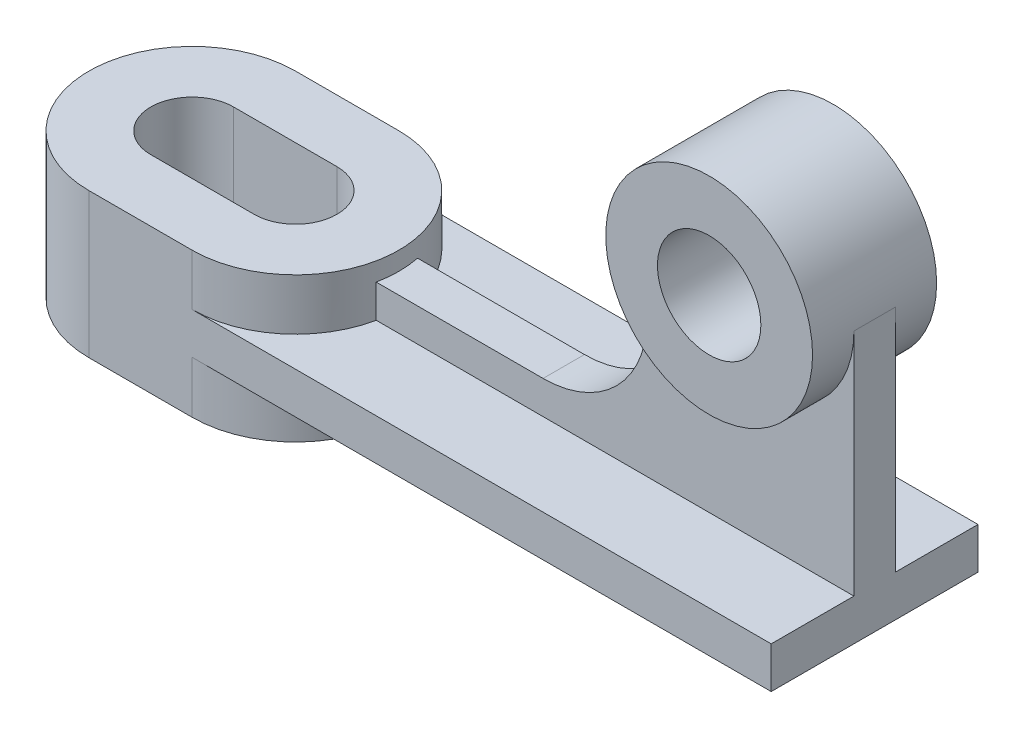
ISO-10303-21;
HEADER;
FILE_DESCRIPTION(('STEP AP214'),'2;1');
FILE_NAME('part.step','',(''),(''),'','','');
FILE_SCHEMA(('AUTOMOTIVE_DESIGN { 1 0 10303 214 1 1 1 1 }'));
ENDSEC;
DATA;
#1=APPLICATION_CONTEXT('core data for automotive mechanical design processes');
#2=APPLICATION_PROTOCOL_DEFINITION('international standard','automotive_design',2000,#1);
#3=PRODUCT_CONTEXT('',#1,'mechanical');
#4=PRODUCT('Part','Part','',(#3));
#5=PRODUCT_RELATED_PRODUCT_CATEGORY('part','',(#4));
#6=PRODUCT_DEFINITION_FORMATION('','',#4);
#7=PRODUCT_DEFINITION_CONTEXT('part definition',#1,'design');
#8=PRODUCT_DEFINITION('design','',#6,#7);
#9=PRODUCT_DEFINITION_SHAPE('','',#8);
#10=(LENGTH_UNIT() NAMED_UNIT(*) SI_UNIT(.MILLI.,.METRE.));
#11=(NAMED_UNIT(*) PLANE_ANGLE_UNIT() SI_UNIT($,.RADIAN.));
#12=(NAMED_UNIT(*) SI_UNIT($,.STERADIAN.) SOLID_ANGLE_UNIT());
#13=UNCERTAINTY_MEASURE_WITH_UNIT(LENGTH_MEASURE(1.E-05),#10,'distance_accuracy_value','');
#14=(GEOMETRIC_REPRESENTATION_CONTEXT(3) GLOBAL_UNCERTAINTY_ASSIGNED_CONTEXT((#13)) GLOBAL_UNIT_ASSIGNED_CONTEXT((#10,
#11,#12)) REPRESENTATION_CONTEXT('',''));
#15=CARTESIAN_POINT('',(0.,0.,0.));
#16=DIRECTION('',(0.,0.,1.));
#17=DIRECTION('',(1.,0.,0.));
#18=AXIS2_PLACEMENT_3D('',#15,#16,#17);
#19=CARTESIAN_POINT('',(127.5,78.0704673986052,15.));
#20=DIRECTION('',(0.,0.,1.));
#21=DIRECTION('',(1.,0.,0.));
#22=AXIS2_PLACEMENT_3D('',#19,#20,#21);
#23=PLANE('',#22);
#24=CARTESIAN_POINT('',(127.5,78.0704673986052,15.));
#25=DIRECTION('',(0.,0.,1.));
#26=DIRECTION('',(1.,0.,0.));
#27=AXIS2_PLACEMENT_3D('',#24,#25,#26);
#28=CIRCLE('',#27,25.);
#29=CARTESIAN_POINT('',(152.5,78.0704673986052,15.));
#30=VERTEX_POINT('',#29);
#31=EDGE_CURVE('E11',#30,#30,#28,.T.);
#32=ORIENTED_EDGE('',*,*,#31,.T.);
#33=EDGE_LOOP('',(#32));
#34=FACE_BOUND('',#33,.T.);
#35=CARTESIAN_POINT('',(127.5,78.0704673986052,15.));
#36=DIRECTION('',(0.,0.,1.));
#37=DIRECTION('',(1.,0.,0.));
#38=AXIS2_PLACEMENT_3D('',#35,#36,#37);
#39=CIRCLE('',#38,12.5);
#40=CARTESIAN_POINT('',(140.,78.0704673986052,15.));
#41=VERTEX_POINT('',#40);
#42=EDGE_CURVE('E56',#41,#41,#39,.T.);
#43=ORIENTED_EDGE('',*,*,#42,.F.);
#44=EDGE_LOOP('',(#43));
#45=FACE_BOUND('',#44,.T.);
#46=ADVANCED_FACE('F45',(#34,#45),#23,.T.);
#47=CARTESIAN_POINT('',(127.5,78.0704673986052,-15.));
#48=DIRECTION('',(0.,0.,1.));
#49=DIRECTION('',(1.,0.,0.));
#50=AXIS2_PLACEMENT_3D('',#47,#48,#49);
#51=PLANE('',#50);
#52=CARTESIAN_POINT('',(127.5,78.0704673986052,-15.));
#53=DIRECTION('',(0.,0.,1.));
#54=DIRECTION('',(1.,0.,0.));
#55=AXIS2_PLACEMENT_3D('',#52,#53,#54);
#56=CIRCLE('',#55,25.);
#57=CARTESIAN_POINT('',(152.5,78.0704673986052,-15.));
#58=VERTEX_POINT('',#57);
#59=EDGE_CURVE('E49',#58,#58,#56,.T.);
#60=ORIENTED_EDGE('',*,*,#59,.F.);
#61=EDGE_LOOP('',(#60));
#62=FACE_BOUND('',#61,.T.);
#63=CARTESIAN_POINT('',(127.5,78.0704673986052,-15.));
#64=DIRECTION('',(0.,0.,1.));
#65=DIRECTION('',(1.,0.,0.));
#66=AXIS2_PLACEMENT_3D('',#63,#64,#65);
#67=CIRCLE('',#66,12.5);
#68=CARTESIAN_POINT('',(140.,78.0704673986052,-15.));
#69=VERTEX_POINT('',#68);
#70=EDGE_CURVE('E58',#69,#69,#67,.T.);
#71=ORIENTED_EDGE('',*,*,#70,.T.);
#72=EDGE_LOOP('',(#71));
#73=FACE_BOUND('',#72,.T.);
#74=ADVANCED_FACE('F68',(#62,#73),#51,.F.);
#75=CARTESIAN_POINT('',(127.5,78.0704673986052,15.));
#76=DIRECTION('',(0.,0.,-1.));
#77=DIRECTION('',(-1.,0.,0.));
#78=AXIS2_PLACEMENT_3D('',#75,#76,#77);
#79=CYLINDRICAL_SURFACE('',#78,25.);
#80=ORIENTED_EDGE('',*,*,#31,.F.);
#81=EDGE_LOOP('',(#80));
#82=FACE_BOUND('',#81,.T.);
#83=ORIENTED_EDGE('',*,*,#59,.T.);
#84=EDGE_LOOP('',(#83));
#85=FACE_BOUND('',#84,.T.);
#86=ADVANCED_FACE('F47',(#82,#85),#79,.T.);
#87=CARTESIAN_POINT('',(127.5,78.0704673986052,15.));
#88=DIRECTION('',(0.,0.,-1.));
#89=DIRECTION('',(-1.,0.,0.));
#90=AXIS2_PLACEMENT_3D('',#87,#88,#89);
#91=CYLINDRICAL_SURFACE('',#90,12.5);
#92=ORIENTED_EDGE('',*,*,#42,.T.);
#93=EDGE_LOOP('',(#92));
#94=FACE_BOUND('',#93,.T.);
#95=ORIENTED_EDGE('',*,*,#70,.F.);
#96=EDGE_LOOP('',(#95));
#97=FACE_BOUND('',#96,.T.);
#98=ADVANCED_FACE('F64',(#94,#97),#91,.F.);
#99=CLOSED_SHELL('',(#46,#74,#86,#98));
#100=MANIFOLD_SOLID_BREP('B2',#99);
#101=CARTESIAN_POINT('',(-37.501,22.5704673986052,25.));
#102=DIRECTION('',(0.,1.,0.));
#103=DIRECTION('',(0.,0.,1.));
#104=AXIS2_PLACEMENT_3D('',#101,#102,#103);
#105=PLANE('',#104);
#106=DIRECTION('',(1.,0.,0.));
#107=VECTOR('',#106,1.);
#108=CARTESIAN_POINT('',(152.5,22.5704673986052,5.));
#109=LINE('',#108,#107);
#110=CARTESIAN_POINT('',(36.99489742786,22.5704673986052,5.));
#111=VERTEX_POINT('',#110);
#112=CARTESIAN_POINT('',(152.5,22.5704673986052,5.));
#113=VERTEX_POINT('',#112);
#114=EDGE_CURVE('E250',#111,#113,#109,.T.);
#115=ORIENTED_EDGE('',*,*,#114,.F.);
#116=CARTESIAN_POINT('',(12.5,22.5704673986052,0.));
#117=DIRECTION('',(0.,1.,0.));
#118=DIRECTION('',(0.,0.,1.));
#119=AXIS2_PLACEMENT_3D('',#116,#117,#118);
#120=CIRCLE('',#119,25.);
#121=CARTESIAN_POINT('',(12.5,22.5704673986052,25.));
#122=VERTEX_POINT('',#121);
#123=EDGE_CURVE('E254',#111,#122,#120,.F.);
#124=ORIENTED_EDGE('',*,*,#123,.T.);
#125=DIRECTION('',(1.,0.,0.));
#126=VECTOR('',#125,1.);
#127=CARTESIAN_POINT('',(-37.501,22.5704673986052,25.));
#128=LINE('',#127,#126);
#129=CARTESIAN_POINT('',(152.5,22.5704673986052,25.));
#130=VERTEX_POINT('',#129);
#131=EDGE_CURVE('E377',#122,#130,#128,.T.);
#132=ORIENTED_EDGE('',*,*,#131,.T.);
#133=DIRECTION('',(0.,0.,1.));
#134=VECTOR('',#133,1.);
#135=CARTESIAN_POINT('',(152.5,22.5704673986052,25.));
#136=LINE('',#135,#134);
#137=EDGE_CURVE('E256',#113,#130,#136,.T.);
#138=ORIENTED_EDGE('',*,*,#137,.F.);
#139=EDGE_LOOP('',(#115,#124,#132,#138));
#140=FACE_BOUND('',#139,.T.);
#141=ADVANCED_FACE('F120',(#140),#105,.T.);
#142=CARTESIAN_POINT('',(12.5,35.,0.));
#143=DIRECTION('',(0.,-1.,0.));
#144=DIRECTION('',(0.,0.,-1.));
#145=AXIS2_PLACEMENT_3D('',#142,#143,#144);
#146=CYLINDRICAL_SURFACE('',#145,25.);
#147=DIRECTION('',(0.,-1.,0.));
#148=VECTOR('',#147,1.);
#149=CARTESIAN_POINT('',(36.9948974278318,35.,5.));
#150=LINE('',#149,#148);
#151=CARTESIAN_POINT('',(36.99489742786,30.5704673986052,5.));
#152=VERTEX_POINT('',#151);
#153=EDGE_CURVE('E264',#111,#152,#150,.F.);
#154=ORIENTED_EDGE('',*,*,#153,.T.);
#155=CARTESIAN_POINT('',(12.5,30.5704673986052,0.));
#156=DIRECTION('',(0.,-1.,0.));
#157=DIRECTION('',(0.,0.,-1.));
#158=AXIS2_PLACEMENT_3D('',#155,#156,#157);
#159=CIRCLE('',#158,25.);
#160=CARTESIAN_POINT('',(36.99489742786,30.5704673986052,-5.));
#161=VERTEX_POINT('',#160);
#162=EDGE_CURVE('E430',#152,#161,#159,.F.);
#163=ORIENTED_EDGE('',*,*,#162,.T.);
#164=DIRECTION('',(0.,-1.,0.));
#165=VECTOR('',#164,1.);
#166=CARTESIAN_POINT('',(36.9948974278318,35.,-5.));
#167=LINE('',#166,#165);
#168=CARTESIAN_POINT('',(36.9948974278318,22.5704673986052,-5.));
#169=VERTEX_POINT('',#168);
#170=EDGE_CURVE('E369',#161,#169,#167,.T.);
#171=ORIENTED_EDGE('',*,*,#170,.T.);
#172=CARTESIAN_POINT('',(12.5,22.5704673986052,-25.));
#173=VERTEX_POINT('',#172);
#174=EDGE_CURVE('E276',#173,#169,#120,.F.);
#175=ORIENTED_EDGE('',*,*,#174,.F.);
#176=DIRECTION('',(0.,-1.,0.));
#177=VECTOR('',#176,1.);
#178=CARTESIAN_POINT('',(12.5,35.,-25.));
#179=LINE('',#178,#177);
#180=CARTESIAN_POINT('',(12.5,35.,-25.));
#181=VERTEX_POINT('',#180);
#182=EDGE_CURVE('E339',#181,#173,#179,.T.);
#183=ORIENTED_EDGE('',*,*,#182,.F.);
#184=CARTESIAN_POINT('',(12.5,35.,0.));
#185=DIRECTION('',(0.,1.,0.));
#186=DIRECTION('',(0.,0.,1.));
#187=AXIS2_PLACEMENT_3D('',#184,#185,#186);
#188=CIRCLE('',#187,25.);
#189=CARTESIAN_POINT('',(12.5,35.,25.));
#190=VERTEX_POINT('',#189);
#191=EDGE_CURVE('E322',#190,#181,#188,.T.);
#192=ORIENTED_EDGE('',*,*,#191,.F.);
#193=DIRECTION('',(0.,-1.,0.));
#194=VECTOR('',#193,1.);
#195=CARTESIAN_POINT('',(12.5,35.,25.));
#196=LINE('',#195,#194);
#197=EDGE_CURVE('E128',#190,#122,#196,.T.);
#198=ORIENTED_EDGE('',*,*,#197,.T.);
#199=ORIENTED_EDGE('',*,*,#123,.F.);
#200=EDGE_LOOP('',(#154,#163,#171,#175,#183,#192,#198,#199));
#201=FACE_BOUND('',#200,.T.);
#202=ADVANCED_FACE('F273',(#201),#146,.T.);
#203=DIRECTION('',(1.,0.,0.));
#204=VECTOR('',#203,1.);
#205=CARTESIAN_POINT('',(-500000.,22.5704673986052,-5.));
#206=LINE('',#205,#204);
#207=CARTESIAN_POINT('',(152.5,22.5704673986052,-5.));
#208=VERTEX_POINT('',#207);
#209=EDGE_CURVE('E372',#169,#208,#206,.T.);
#210=ORIENTED_EDGE('',*,*,#209,.T.);
#211=CARTESIAN_POINT('',(152.5,22.5704673986052,-25.));
#212=VERTEX_POINT('',#211);
#213=EDGE_CURVE('E375',#212,#208,#136,.T.);
#214=ORIENTED_EDGE('',*,*,#213,.F.);
#215=DIRECTION('',(1.,0.,0.));
#216=VECTOR('',#215,1.);
#217=CARTESIAN_POINT('',(-37.501,22.5704673986052,-25.));
#218=LINE('',#217,#216);
#219=EDGE_CURVE('E284',#173,#212,#218,.T.);
#220=ORIENTED_EDGE('',*,*,#219,.F.);
#221=ORIENTED_EDGE('',*,*,#174,.T.);
#222=EDGE_LOOP('',(#210,#214,#220,#221));
#223=FACE_BOUND('',#222,.T.);
#224=ADVANCED_FACE('F371',(#223),#105,.T.);
#225=CARTESIAN_POINT('',(-12.5,35.,0.));
#226=DIRECTION('',(0.,1.,0.));
#227=DIRECTION('',(0.,0.,1.));
#228=AXIS2_PLACEMENT_3D('',#225,#226,#227);
#229=PLANE('',#228);
#230=CARTESIAN_POINT('',(-12.5,35.,0.));
#231=DIRECTION('',(0.,1.,0.));
#232=DIRECTION('',(0.,0.,1.));
#233=AXIS2_PLACEMENT_3D('',#230,#231,#232);
#234=CIRCLE('',#233,25.);
#235=CARTESIAN_POINT('',(-12.5,35.,-25.));
#236=VERTEX_POINT('',#235);
#237=CARTESIAN_POINT('',(-12.5,35.,25.));
#238=VERTEX_POINT('',#237);
#239=EDGE_CURVE('E316',#236,#238,#234,.T.);
#240=ORIENTED_EDGE('',*,*,#239,.T.);
#241=DIRECTION('',(1.,0.,0.));
#242=VECTOR('',#241,1.);
#243=CARTESIAN_POINT('',(-12.5,35.,25.));
#244=LINE('',#243,#242);
#245=EDGE_CURVE('E319',#238,#190,#244,.T.);
#246=ORIENTED_EDGE('',*,*,#245,.T.);
#247=ORIENTED_EDGE('',*,*,#191,.T.);
#248=DIRECTION('',(-1.,0.,0.));
#249=VECTOR('',#248,1.);
#250=CARTESIAN_POINT('',(-12.5,35.,-25.));
#251=LINE('',#250,#249);
#252=EDGE_CURVE('E324',#181,#236,#251,.T.);
#253=ORIENTED_EDGE('',*,*,#252,.T.);
#254=EDGE_LOOP('',(#240,#246,#247,#253));
#255=FACE_BOUND('',#254,.T.);
#256=DIRECTION('',(1.,0.,0.));
#257=VECTOR('',#256,1.);
#258=CARTESIAN_POINT('',(-12.5,35.,10.));
#259=LINE('',#258,#257);
#260=CARTESIAN_POINT('',(-12.5,35.,10.));
#261=VERTEX_POINT('',#260);
#262=CARTESIAN_POINT('',(12.5,35.,10.));
#263=VERTEX_POINT('',#262);
#264=EDGE_CURVE('E288',#261,#263,#259,.T.);
#265=ORIENTED_EDGE('',*,*,#264,.F.);
#266=CARTESIAN_POINT('',(-12.5,35.,0.));
#267=DIRECTION('',(0.,1.,0.));
#268=DIRECTION('',(0.,0.,1.));
#269=AXIS2_PLACEMENT_3D('',#266,#267,#268);
#270=CIRCLE('',#269,10.);
#271=CARTESIAN_POINT('',(-12.5,35.,-10.));
#272=VERTEX_POINT('',#271);
#273=EDGE_CURVE('E286',#272,#261,#270,.T.);
#274=ORIENTED_EDGE('',*,*,#273,.F.);
#275=DIRECTION('',(-1.,0.,0.));
#276=VECTOR('',#275,1.);
#277=CARTESIAN_POINT('',(-12.5,35.,-10.));
#278=LINE('',#277,#276);
#279=CARTESIAN_POINT('',(12.5,35.,-10.));
#280=VERTEX_POINT('',#279);
#281=EDGE_CURVE('E293',#280,#272,#278,.T.);
#282=ORIENTED_EDGE('',*,*,#281,.F.);
#283=CARTESIAN_POINT('',(12.5,35.,0.));
#284=DIRECTION('',(0.,1.,0.));
#285=DIRECTION('',(0.,0.,1.));
#286=AXIS2_PLACEMENT_3D('',#283,#284,#285);
#287=CIRCLE('',#286,10.);
#288=EDGE_CURVE('E291',#263,#280,#287,.T.);
#289=ORIENTED_EDGE('',*,*,#288,.F.);
#290=EDGE_LOOP('',(#265,#274,#282,#289));
#291=FACE_BOUND('',#290,.T.);
#292=ADVANCED_FACE('F362',(#255,#291),#229,.T.);
#293=CARTESIAN_POINT('',(-12.5,0.,0.));
#294=DIRECTION('',(0.,1.,0.));
#295=DIRECTION('',(0.,0.,1.));
#296=AXIS2_PLACEMENT_3D('',#293,#294,#295);
#297=PLANE('',#296);
#298=CARTESIAN_POINT('',(-12.5,0.,0.));
#299=DIRECTION('',(0.,1.,0.));
#300=DIRECTION('',(0.,0.,1.));
#301=AXIS2_PLACEMENT_3D('',#298,#299,#300);
#302=CIRCLE('',#301,25.);
#303=CARTESIAN_POINT('',(-12.5,0.,-25.));
#304=VERTEX_POINT('',#303);
#305=CARTESIAN_POINT('',(-12.5,0.,25.));
#306=VERTEX_POINT('',#305);
#307=EDGE_CURVE('E315',#304,#306,#302,.T.);
#308=ORIENTED_EDGE('',*,*,#307,.F.);
#309=DIRECTION('',(-1.,0.,0.));
#310=VECTOR('',#309,1.);
#311=CARTESIAN_POINT('',(-12.5,0.,-25.));
#312=LINE('',#311,#310);
#313=CARTESIAN_POINT('',(12.5,0.,-25.));
#314=VERTEX_POINT('',#313);
#315=EDGE_CURVE('E320',#314,#304,#312,.T.);
#316=ORIENTED_EDGE('',*,*,#315,.F.);
#317=CARTESIAN_POINT('',(12.5,0.,0.));
#318=DIRECTION('',(0.,1.,0.));
#319=DIRECTION('',(0.,0.,1.));
#320=AXIS2_PLACEMENT_3D('',#317,#318,#319);
#321=CIRCLE('',#320,25.);
#322=CARTESIAN_POINT('',(12.5,0.,25.));
#323=VERTEX_POINT('',#322);
#324=EDGE_CURVE('E332',#323,#314,#321,.T.);
#325=ORIENTED_EDGE('',*,*,#324,.F.);
#326=DIRECTION('',(1.,0.,0.));
#327=VECTOR('',#326,1.);
#328=CARTESIAN_POINT('',(-12.5,0.,25.));
#329=LINE('',#328,#327);
#330=EDGE_CURVE('E329',#306,#323,#329,.T.);
#331=ORIENTED_EDGE('',*,*,#330,.F.);
#332=EDGE_LOOP('',(#308,#316,#325,#331));
#333=FACE_BOUND('',#332,.T.);
#334=CARTESIAN_POINT('',(-12.5,0.,0.));
#335=DIRECTION('',(0.,1.,0.));
#336=DIRECTION('',(0.,0.,1.));
#337=AXIS2_PLACEMENT_3D('',#334,#335,#336);
#338=CIRCLE('',#337,10.);
#339=CARTESIAN_POINT('',(-12.5,0.,-10.));
#340=VERTEX_POINT('',#339);
#341=CARTESIAN_POINT('',(-12.5,0.,10.));
#342=VERTEX_POINT('',#341);
#343=EDGE_CURVE('E296',#340,#342,#338,.T.);
#344=ORIENTED_EDGE('',*,*,#343,.T.);
#345=DIRECTION('',(1.,0.,0.));
#346=VECTOR('',#345,1.);
#347=CARTESIAN_POINT('',(-12.5,0.,10.));
#348=LINE('',#347,#346);
#349=CARTESIAN_POINT('',(12.5,0.,10.));
#350=VERTEX_POINT('',#349);
#351=EDGE_CURVE('E299',#342,#350,#348,.T.);
#352=ORIENTED_EDGE('',*,*,#351,.T.);
#353=CARTESIAN_POINT('',(12.5,0.,0.));
#354=DIRECTION('',(0.,1.,0.));
#355=DIRECTION('',(0.,0.,1.));
#356=AXIS2_PLACEMENT_3D('',#353,#354,#355);
#357=CIRCLE('',#356,10.);
#358=CARTESIAN_POINT('',(12.5,0.,-10.));
#359=VERTEX_POINT('',#358);
#360=EDGE_CURVE('E302',#350,#359,#357,.T.);
#361=ORIENTED_EDGE('',*,*,#360,.T.);
#362=DIRECTION('',(-1.,0.,0.));
#363=VECTOR('',#362,1.);
#364=CARTESIAN_POINT('',(-12.5,0.,-10.));
#365=LINE('',#364,#363);
#366=EDGE_CURVE('E289',#359,#340,#365,.T.);
#367=ORIENTED_EDGE('',*,*,#366,.T.);
#368=EDGE_LOOP('',(#344,#352,#361,#367));
#369=FACE_BOUND('',#368,.T.);
#370=ADVANCED_FACE('F353',(#333,#369),#297,.F.);
#371=CARTESIAN_POINT('',(-12.5,35.,0.));
#372=DIRECTION('',(0.,-1.,0.));
#373=DIRECTION('',(0.,0.,-1.));
#374=AXIS2_PLACEMENT_3D('',#371,#372,#373);
#375=CYLINDRICAL_SURFACE('',#374,25.);
#376=ORIENTED_EDGE('',*,*,#307,.T.);
#377=DIRECTION('',(0.,-1.,0.));
#378=VECTOR('',#377,1.);
#379=CARTESIAN_POINT('',(-12.5,35.,25.));
#380=LINE('',#379,#378);
#381=EDGE_CURVE('E43',#238,#306,#380,.T.);
#382=ORIENTED_EDGE('',*,*,#381,.F.);
#383=ORIENTED_EDGE('',*,*,#239,.F.);
#384=DIRECTION('',(0.,-1.,0.));
#385=VECTOR('',#384,1.);
#386=CARTESIAN_POINT('',(-12.5,35.,-25.));
#387=LINE('',#386,#385);
#388=EDGE_CURVE('E326',#236,#304,#387,.T.);
#389=ORIENTED_EDGE('',*,*,#388,.T.);
#390=EDGE_LOOP('',(#376,#382,#383,#389));
#391=FACE_BOUND('',#390,.T.);
#392=ADVANCED_FACE('F122',(#391),#375,.T.);
#393=CARTESIAN_POINT('',(-12.5,35.,25.));
#394=DIRECTION('',(0.,0.,-1.));
#395=DIRECTION('',(-1.,0.,0.));
#396=AXIS2_PLACEMENT_3D('',#393,#394,#395);
#397=PLANE('',#396);
#398=ORIENTED_EDGE('',*,*,#330,.T.);
#399=CARTESIAN_POINT('',(12.5,12.5704673986052,25.));
#400=VERTEX_POINT('',#399);
#401=EDGE_CURVE('E341',#400,#323,#196,.T.);
#402=ORIENTED_EDGE('',*,*,#401,.F.);
#403=DIRECTION('',(1.,0.,0.));
#404=VECTOR('',#403,1.);
#405=CARTESIAN_POINT('',(-37.501,12.5704673986052,25.));
#406=LINE('',#405,#404);
#407=CARTESIAN_POINT('',(152.5,12.5704673986052,25.));
#408=VERTEX_POINT('',#407);
#409=EDGE_CURVE('E280',#400,#408,#406,.T.);
#410=ORIENTED_EDGE('',*,*,#409,.T.);
#411=DIRECTION('',(0.,-1.,0.));
#412=VECTOR('',#411,1.);
#413=CARTESIAN_POINT('',(152.5,22.5704673986052,25.));
#414=LINE('',#413,#412);
#415=EDGE_CURVE('E380',#130,#408,#414,.T.);
#416=ORIENTED_EDGE('',*,*,#415,.F.);
#417=ORIENTED_EDGE('',*,*,#131,.F.);
#418=ORIENTED_EDGE('',*,*,#197,.F.);
#419=ORIENTED_EDGE('',*,*,#245,.F.);
#420=ORIENTED_EDGE('',*,*,#381,.T.);
#421=EDGE_LOOP('',(#398,#402,#410,#416,#417,#418,#419,#420));
#422=FACE_BOUND('',#421,.T.);
#423=ADVANCED_FACE('F349',(#422),#397,.F.);
#424=CARTESIAN_POINT('',(12.5,12.5704673986052,-25.));
#425=VERTEX_POINT('',#424);
#426=EDGE_CURVE('E338',#425,#314,#179,.T.);
#427=ORIENTED_EDGE('',*,*,#426,.F.);
#428=CARTESIAN_POINT('',(12.5,12.5704673986052,0.));
#429=DIRECTION('',(0.,-1.,0.));
#430=DIRECTION('',(0.,0.,-1.));
#431=AXIS2_PLACEMENT_3D('',#428,#429,#430);
#432=CIRCLE('',#431,25.);
#433=EDGE_CURVE('E135',#400,#425,#432,.F.);
#434=ORIENTED_EDGE('',*,*,#433,.F.);
#435=ORIENTED_EDGE('',*,*,#401,.T.);
#436=ORIENTED_EDGE('',*,*,#324,.T.);
#437=EDGE_LOOP('',(#427,#434,#435,#436));
#438=FACE_BOUND('',#437,.T.);
#439=ADVANCED_FACE('F345',(#438),#146,.T.);
#440=CARTESIAN_POINT('',(-12.5,35.,-25.));
#441=DIRECTION('',(0.,0.,1.));
#442=DIRECTION('',(1.,0.,0.));
#443=AXIS2_PLACEMENT_3D('',#440,#441,#442);
#444=PLANE('',#443);
#445=ORIENTED_EDGE('',*,*,#315,.T.);
#446=ORIENTED_EDGE('',*,*,#388,.F.);
#447=ORIENTED_EDGE('',*,*,#252,.F.);
#448=ORIENTED_EDGE('',*,*,#182,.T.);
#449=ORIENTED_EDGE('',*,*,#219,.T.);
#450=DIRECTION('',(0.,1.,0.));
#451=VECTOR('',#450,1.);
#452=CARTESIAN_POINT('',(152.5,22.5704673986052,-25.));
#453=LINE('',#452,#451);
#454=CARTESIAN_POINT('',(152.5,12.5704673986052,-25.));
#455=VERTEX_POINT('',#454);
#456=EDGE_CURVE('E391',#455,#212,#453,.T.);
#457=ORIENTED_EDGE('',*,*,#456,.F.);
#458=DIRECTION('',(1.,0.,0.));
#459=VECTOR('',#458,1.);
#460=CARTESIAN_POINT('',(-37.501,12.5704673986052,-25.));
#461=LINE('',#460,#459);
#462=EDGE_CURVE('E277',#425,#455,#461,.T.);
#463=ORIENTED_EDGE('',*,*,#462,.F.);
#464=ORIENTED_EDGE('',*,*,#426,.T.);
#465=EDGE_LOOP('',(#445,#446,#447,#448,#449,#457,#463,#464));
#466=FACE_BOUND('',#465,.T.);
#467=ADVANCED_FACE('F357',(#466),#444,.F.);
#468=CARTESIAN_POINT('',(-12.5,35.,0.));
#469=DIRECTION('',(0.,-1.,0.));
#470=DIRECTION('',(0.,0.,-1.));
#471=AXIS2_PLACEMENT_3D('',#468,#469,#470);
#472=CYLINDRICAL_SURFACE('',#471,10.);
#473=ORIENTED_EDGE('',*,*,#343,.F.);
#474=DIRECTION('',(0.,-1.,0.));
#475=VECTOR('',#474,1.);
#476=CARTESIAN_POINT('',(-12.5,35.,-10.));
#477=LINE('',#476,#475);
#478=EDGE_CURVE('E295',#272,#340,#477,.T.);
#479=ORIENTED_EDGE('',*,*,#478,.F.);
#480=ORIENTED_EDGE('',*,*,#273,.T.);
#481=DIRECTION('',(0.,-1.,0.));
#482=VECTOR('',#481,1.);
#483=CARTESIAN_POINT('',(-12.5,35.,10.));
#484=LINE('',#483,#482);
#485=EDGE_CURVE('E312',#261,#342,#484,.T.);
#486=ORIENTED_EDGE('',*,*,#485,.T.);
#487=EDGE_LOOP('',(#473,#479,#480,#486));
#488=FACE_BOUND('',#487,.T.);
#489=ADVANCED_FACE('F474',(#488),#472,.F.);
#490=CARTESIAN_POINT('',(-12.5,35.,10.));
#491=DIRECTION('',(0.,0.,-1.));
#492=DIRECTION('',(-1.,0.,0.));
#493=AXIS2_PLACEMENT_3D('',#490,#491,#492);
#494=PLANE('',#493);
#495=ORIENTED_EDGE('',*,*,#351,.F.);
#496=ORIENTED_EDGE('',*,*,#485,.F.);
#497=ORIENTED_EDGE('',*,*,#264,.T.);
#498=DIRECTION('',(0.,-1.,0.));
#499=VECTOR('',#498,1.);
#500=CARTESIAN_POINT('',(12.5,35.,10.));
#501=LINE('',#500,#499);
#502=EDGE_CURVE('E310',#263,#350,#501,.T.);
#503=ORIENTED_EDGE('',*,*,#502,.T.);
#504=EDGE_LOOP('',(#495,#496,#497,#503));
#505=FACE_BOUND('',#504,.T.);
#506=ADVANCED_FACE('F504',(#505),#494,.T.);
#507=CARTESIAN_POINT('',(12.5,35.,0.));
#508=DIRECTION('',(0.,-1.,0.));
#509=DIRECTION('',(0.,0.,-1.));
#510=AXIS2_PLACEMENT_3D('',#507,#508,#509);
#511=CYLINDRICAL_SURFACE('',#510,10.);
#512=ORIENTED_EDGE('',*,*,#360,.F.);
#513=ORIENTED_EDGE('',*,*,#502,.F.);
#514=ORIENTED_EDGE('',*,*,#288,.T.);
#515=DIRECTION('',(0.,-1.,0.));
#516=VECTOR('',#515,1.);
#517=CARTESIAN_POINT('',(12.5,35.,-10.));
#518=LINE('',#517,#516);
#519=EDGE_CURVE('E143',#280,#359,#518,.T.);
#520=ORIENTED_EDGE('',*,*,#519,.T.);
#521=EDGE_LOOP('',(#512,#513,#514,#520));
#522=FACE_BOUND('',#521,.T.);
#523=ADVANCED_FACE('F513',(#522),#511,.F.);
#524=CARTESIAN_POINT('',(-12.5,35.,-10.));
#525=DIRECTION('',(0.,0.,1.));
#526=DIRECTION('',(1.,0.,0.));
#527=AXIS2_PLACEMENT_3D('',#524,#525,#526);
#528=PLANE('',#527);
#529=ORIENTED_EDGE('',*,*,#366,.F.);
#530=ORIENTED_EDGE('',*,*,#519,.F.);
#531=ORIENTED_EDGE('',*,*,#281,.T.);
#532=ORIENTED_EDGE('',*,*,#478,.T.);
#533=EDGE_LOOP('',(#529,#530,#531,#532));
#534=FACE_BOUND('',#533,.T.);
#535=ADVANCED_FACE('F522',(#534),#528,.T.);
#536=CARTESIAN_POINT('',(152.5,0.,0.));
#537=DIRECTION('',(1.,0.,0.));
#538=DIRECTION('',(0.,0.,-1.));
#539=AXIS2_PLACEMENT_3D('',#536,#537,#538);
#540=PLANE('',#539);
#541=ORIENTED_EDGE('',*,*,#456,.T.);
#542=ORIENTED_EDGE('',*,*,#213,.T.);
#543=DIRECTION('',(0.,1.,0.));
#544=VECTOR('',#543,1.);
#545=CARTESIAN_POINT('',(152.5,78.0704673986052,-5.));
#546=LINE('',#545,#544);
#547=CARTESIAN_POINT('',(152.5,78.0704673986052,-5.));
#548=VERTEX_POINT('',#547);
#549=EDGE_CURVE('E398',#208,#548,#546,.T.);
#550=ORIENTED_EDGE('',*,*,#549,.T.);
#551=DIRECTION('',(0.,0.,-1.));
#552=VECTOR('',#551,1.);
#553=CARTESIAN_POINT('',(152.5,78.0704673986052,5.));
#554=LINE('',#553,#552);
#555=CARTESIAN_POINT('',(152.5,78.0704673986052,5.));
#556=VERTEX_POINT('',#555);
#557=EDGE_CURVE('E400',#556,#548,#554,.T.);
#558=ORIENTED_EDGE('',*,*,#557,.F.);
#559=DIRECTION('',(0.,1.,0.));
#560=VECTOR('',#559,1.);
#561=CARTESIAN_POINT('',(152.5,78.0704673986052,5.));
#562=LINE('',#561,#560);
#563=EDGE_CURVE('E259',#113,#556,#562,.T.);
#564=ORIENTED_EDGE('',*,*,#563,.F.);
#565=ORIENTED_EDGE('',*,*,#137,.T.);
#566=ORIENTED_EDGE('',*,*,#415,.T.);
#567=DIRECTION('',(0.,0.,-1.));
#568=VECTOR('',#567,1.);
#569=CARTESIAN_POINT('',(152.5,12.5704673986052,25.));
#570=LINE('',#569,#568);
#571=EDGE_CURVE('E378',#408,#455,#570,.T.);
#572=ORIENTED_EDGE('',*,*,#571,.T.);
#573=EDGE_LOOP('',(#541,#542,#550,#558,#564,#565,#566,#572));
#574=FACE_BOUND('',#573,.T.);
#575=ADVANCED_FACE('F389',(#574),#540,.T.);
#576=CARTESIAN_POINT('',(-37.501,12.5704673986052,25.));
#577=DIRECTION('',(0.,-1.,0.));
#578=DIRECTION('',(0.,0.,-1.));
#579=AXIS2_PLACEMENT_3D('',#576,#577,#578);
#580=PLANE('',#579);
#581=ORIENTED_EDGE('',*,*,#409,.F.);
#582=ORIENTED_EDGE('',*,*,#433,.T.);
#583=ORIENTED_EDGE('',*,*,#462,.T.);
#584=ORIENTED_EDGE('',*,*,#571,.F.);
#585=EDGE_LOOP('',(#581,#582,#583,#584));
#586=FACE_BOUND('',#585,.T.);
#587=ADVANCED_FACE('F390',(#586),#580,.T.);
#588=CARTESIAN_POINT('',(-500000.,30.5704673986052,5.));
#589=DIRECTION('',(0.,-1.,0.));
#590=DIRECTION('',(0.,0.,-1.));
#591=AXIS2_PLACEMENT_3D('',#588,#589,#590);
#592=PLANE('',#591);
#593=ORIENTED_EDGE('',*,*,#162,.F.);
#594=DIRECTION('',(-1.,0.,0.));
#595=VECTOR('',#594,1.);
#596=CARTESIAN_POINT('',(37.5,30.5704673986052,5.));
#597=LINE('',#596,#595);
#598=CARTESIAN_POINT('',(77.3482120801464,30.5704673986052,5.));
#599=VERTEX_POINT('',#598);
#600=EDGE_CURVE('E260',#599,#152,#597,.T.);
#601=ORIENTED_EDGE('',*,*,#600,.F.);
#602=DIRECTION('',(0.,0.,-1.));
#603=VECTOR('',#602,1.);
#604=CARTESIAN_POINT('',(77.3482120801464,30.5704673986052,5.));
#605=LINE('',#604,#603);
#606=CARTESIAN_POINT('',(77.3482120801464,30.5704673986052,-5.));
#607=VERTEX_POINT('',#606);
#608=EDGE_CURVE('E411',#599,#607,#605,.T.);
#609=ORIENTED_EDGE('',*,*,#608,.T.);
#610=DIRECTION('',(1.,0.,0.));
#611=VECTOR('',#610,1.);
#612=CARTESIAN_POINT('',(-500000.,30.5704673986052,-5.));
#613=LINE('',#612,#611);
#614=EDGE_CURVE('E393',#161,#607,#613,.T.);
#615=ORIENTED_EDGE('',*,*,#614,.F.);
#616=EDGE_LOOP('',(#593,#601,#609,#615));
#617=FACE_BOUND('',#616,.T.);
#618=ADVANCED_FACE('F439',(#617),#592,.F.);
#619=CARTESIAN_POINT('',(-500000.,30.5704673986052,-5.));
#620=DIRECTION('',(0.,0.,1.));
#621=DIRECTION('',(1.,0.,0.));
#622=AXIS2_PLACEMENT_3D('',#619,#620,#621);
#623=PLANE('',#622);
#624=ORIENTED_EDGE('',*,*,#170,.F.);
#625=ORIENTED_EDGE('',*,*,#614,.T.);
#626=CARTESIAN_POINT('',(77.3482120801464,55.7222553184588,-5.));
#627=DIRECTION('',(0.,0.,-1.));
#628=DIRECTION('',(-1.,0.,0.));
#629=AXIS2_PLACEMENT_3D('',#626,#627,#628);
#630=CIRCLE('',#629,25.1517879198536);
#631=CARTESIAN_POINT('',(102.5,55.7222553184588,-5.));
#632=VERTEX_POINT('',#631);
#633=EDGE_CURVE('E405',#632,#607,#630,.T.);
#634=ORIENTED_EDGE('',*,*,#633,.F.);
#635=DIRECTION('',(0.,-1.,0.));
#636=VECTOR('',#635,1.);
#637=CARTESIAN_POINT('',(102.5,78.0704673986052,-5.));
#638=LINE('',#637,#636);
#639=CARTESIAN_POINT('',(102.5,78.0704673986052,-5.));
#640=VERTEX_POINT('',#639);
#641=EDGE_CURVE('E415',#640,#632,#638,.T.);
#642=ORIENTED_EDGE('',*,*,#641,.F.);
#643=CARTESIAN_POINT('',(127.5,78.0704673986052,-5.));
#644=DIRECTION('',(0.,0.,-1.));
#645=DIRECTION('',(1.,0.,0.));
#646=AXIS2_PLACEMENT_3D('',#643,#644,#645);
#647=CIRCLE('',#646,25.);
#648=EDGE_CURVE('E270',#548,#640,#647,.T.);
#649=ORIENTED_EDGE('',*,*,#648,.F.);
#650=ORIENTED_EDGE('',*,*,#549,.F.);
#651=ORIENTED_EDGE('',*,*,#209,.F.);
#652=EDGE_LOOP('',(#624,#625,#634,#642,#649,#650,#651));
#653=FACE_BOUND('',#652,.T.);
#654=ADVANCED_FACE('F413',(#653),#623,.F.);
#655=CARTESIAN_POINT('',(127.5,78.0704673986052,5.));
#656=DIRECTION('',(0.,0.,-1.));
#657=DIRECTION('',(-1.,0.,0.));
#658=AXIS2_PLACEMENT_3D('',#655,#656,#657);
#659=CYLINDRICAL_SURFACE('',#658,25.);
#660=ORIENTED_EDGE('',*,*,#648,.T.);
#661=DIRECTION('',(0.,0.,-1.));
#662=VECTOR('',#661,1.);
#663=CARTESIAN_POINT('',(102.5,78.0704673986052,5.));
#664=LINE('',#663,#662);
#665=CARTESIAN_POINT('',(102.5,78.0704673986052,5.));
#666=VERTEX_POINT('',#665);
#667=EDGE_CURVE('E428',#666,#640,#664,.T.);
#668=ORIENTED_EDGE('',*,*,#667,.F.);
#669=CARTESIAN_POINT('',(127.5,78.0704673986052,5.));
#670=DIRECTION('',(0.,0.,-1.));
#671=DIRECTION('',(1.,0.,0.));
#672=AXIS2_PLACEMENT_3D('',#669,#670,#671);
#673=CIRCLE('',#672,25.);
#674=EDGE_CURVE('E404',#556,#666,#673,.T.);
#675=ORIENTED_EDGE('',*,*,#674,.F.);
#676=ORIENTED_EDGE('',*,*,#557,.T.);
#677=EDGE_LOOP('',(#660,#668,#675,#676));
#678=FACE_BOUND('',#677,.T.);
#679=ADVANCED_FACE('F409',(#678),#659,.F.);
#680=CARTESIAN_POINT('',(102.5,78.0704673986052,5.));
#681=DIRECTION('',(1.,0.,0.));
#682=DIRECTION('',(0.,1.,0.));
#683=AXIS2_PLACEMENT_3D('',#680,#681,#682);
#684=PLANE('',#683);
#685=ORIENTED_EDGE('',*,*,#641,.T.);
#686=DIRECTION('',(0.,0.,-1.));
#687=VECTOR('',#686,1.);
#688=CARTESIAN_POINT('',(102.5,55.7222553184588,5.));
#689=LINE('',#688,#687);
#690=CARTESIAN_POINT('',(102.5,55.7222553184588,5.));
#691=VERTEX_POINT('',#690);
#692=EDGE_CURVE('E425',#691,#632,#689,.T.);
#693=ORIENTED_EDGE('',*,*,#692,.F.);
#694=DIRECTION('',(0.,-1.,0.));
#695=VECTOR('',#694,1.);
#696=CARTESIAN_POINT('',(102.5,78.0704673986052,5.));
#697=LINE('',#696,#695);
#698=EDGE_CURVE('E442',#666,#691,#697,.T.);
#699=ORIENTED_EDGE('',*,*,#698,.F.);
#700=ORIENTED_EDGE('',*,*,#667,.T.);
#701=EDGE_LOOP('',(#685,#693,#699,#700));
#702=FACE_BOUND('',#701,.T.);
#703=ADVANCED_FACE('F447',(#702),#684,.F.);
#704=CARTESIAN_POINT('',(77.3482120801464,55.7222553184588,5.));
#705=DIRECTION('',(0.,0.,-1.));
#706=DIRECTION('',(-1.,0.,0.));
#707=AXIS2_PLACEMENT_3D('',#704,#705,#706);
#708=CYLINDRICAL_SURFACE('',#707,25.1517879198536);
#709=ORIENTED_EDGE('',*,*,#633,.T.);
#710=ORIENTED_EDGE('',*,*,#608,.F.);
#711=CARTESIAN_POINT('',(77.3482120801464,55.7222553184588,5.));
#712=DIRECTION('',(0.,0.,-1.));
#713=DIRECTION('',(-1.,0.,0.));
#714=AXIS2_PLACEMENT_3D('',#711,#712,#713);
#715=CIRCLE('',#714,25.1517879198536);
#716=EDGE_CURVE('E440',#691,#599,#715,.T.);
#717=ORIENTED_EDGE('',*,*,#716,.F.);
#718=ORIENTED_EDGE('',*,*,#692,.T.);
#719=EDGE_LOOP('',(#709,#710,#717,#718));
#720=FACE_BOUND('',#719,.T.);
#721=ADVANCED_FACE('F436',(#720),#708,.F.);
#722=CARTESIAN_POINT('',(127.5,78.0704673986052,5.));
#723=DIRECTION('',(0.,0.,1.));
#724=DIRECTION('',(1.,0.,0.));
#725=AXIS2_PLACEMENT_3D('',#722,#723,#724);
#726=PLANE('',#725);
#727=ORIENTED_EDGE('',*,*,#674,.T.);
#728=ORIENTED_EDGE('',*,*,#698,.T.);
#729=ORIENTED_EDGE('',*,*,#716,.T.);
#730=ORIENTED_EDGE('',*,*,#600,.T.);
#731=ORIENTED_EDGE('',*,*,#153,.F.);
#732=ORIENTED_EDGE('',*,*,#114,.T.);
#733=ORIENTED_EDGE('',*,*,#563,.T.);
#734=EDGE_LOOP('',(#727,#728,#729,#730,#731,#732,#733));
#735=FACE_BOUND('',#734,.T.);
#736=ADVANCED_FACE('F266',(#735),#726,.T.);
#737=CLOSED_SHELL('',(#141,#202,#224,#292,#370,#392,#423,#439,#467,#489,#506,#523,#535,#575,
#587,#618,#654,#679,#703,#721,#736));
#738=MANIFOLD_SOLID_BREP('B6',#737);
#739=ADVANCED_BREP_SHAPE_REPRESENTATION('',(#18,#100,#738),#14);
#740=SHAPE_DEFINITION_REPRESENTATION(#9,#739);
ENDSEC;
END-ISO-10303-21;
